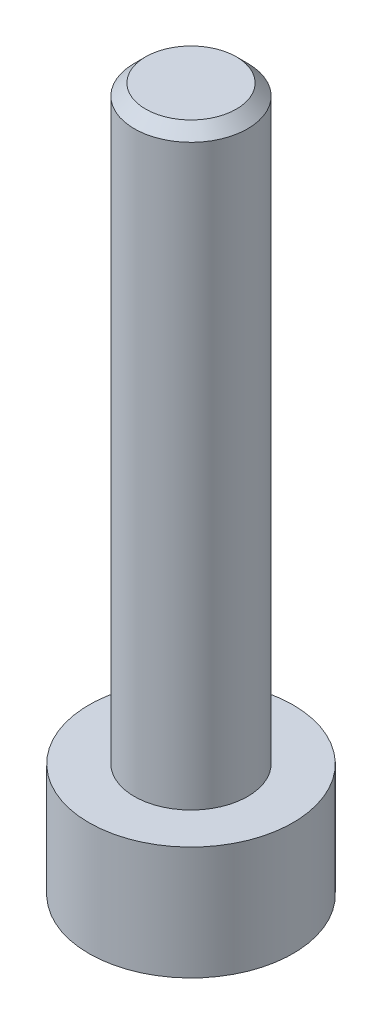
ISO-10303-21;
HEADER;
FILE_DESCRIPTION(('STEP AP214'),'2;1');
FILE_NAME('part.step','',(''),(''),'','','');
FILE_SCHEMA(('AUTOMOTIVE_DESIGN { 1 0 10303 214 1 1 1 1 }'));
ENDSEC;
DATA;
#1=APPLICATION_CONTEXT('core data for automotive mechanical design processes');
#2=APPLICATION_PROTOCOL_DEFINITION('international standard','automotive_design',2000,#1);
#3=PRODUCT_CONTEXT('',#1,'mechanical');
#4=PRODUCT('Part','Part','',(#3));
#5=PRODUCT_RELATED_PRODUCT_CATEGORY('part','',(#4));
#6=PRODUCT_DEFINITION_FORMATION('','',#4);
#7=PRODUCT_DEFINITION_CONTEXT('part definition',#1,'design');
#8=PRODUCT_DEFINITION('design','',#6,#7);
#9=PRODUCT_DEFINITION_SHAPE('','',#8);
#10=(LENGTH_UNIT() NAMED_UNIT(*) SI_UNIT(.MILLI.,.METRE.));
#11=(NAMED_UNIT(*) PLANE_ANGLE_UNIT() SI_UNIT($,.RADIAN.));
#12=(NAMED_UNIT(*) SI_UNIT($,.STERADIAN.) SOLID_ANGLE_UNIT());
#13=UNCERTAINTY_MEASURE_WITH_UNIT(LENGTH_MEASURE(1.E-05),#10,'distance_accuracy_value','');
#14=(GEOMETRIC_REPRESENTATION_CONTEXT(3) GLOBAL_UNCERTAINTY_ASSIGNED_CONTEXT((#13)) GLOBAL_UNIT_ASSIGNED_CONTEXT((#10,
#11,#12)) REPRESENTATION_CONTEXT('',''));
#15=CARTESIAN_POINT('',(0.,0.,0.));
#16=DIRECTION('',(0.,0.,1.));
#17=DIRECTION('',(1.,0.,0.));
#18=AXIS2_PLACEMENT_3D('',#15,#16,#17);
#19=CARTESIAN_POINT('',(0.,2.5,0.));
#20=DIRECTION('',(0.,-1.,0.));
#21=DIRECTION('',(0.,0.,-1.));
#22=AXIS2_PLACEMENT_3D('',#19,#20,#21);
#23=CYLINDRICAL_SURFACE('',#22,2.25);
#24=CARTESIAN_POINT('',(0.,2.5,0.));
#25=DIRECTION('',(0.,1.,0.));
#26=DIRECTION('',(0.,0.,1.));
#27=AXIS2_PLACEMENT_3D('',#24,#25,#26);
#28=CIRCLE('',#27,2.25);
#29=CARTESIAN_POINT('',(0.,2.5,2.25));
#30=VERTEX_POINT('',#29);
#31=EDGE_CURVE('E161',#30,#30,#28,.T.);
#32=ORIENTED_EDGE('',*,*,#31,.F.);
#33=EDGE_LOOP('',(#32));
#34=FACE_BOUND('',#33,.T.);
#35=CARTESIAN_POINT('',(0.,0.,0.));
#36=DIRECTION('',(0.,1.,0.));
#37=DIRECTION('',(0.,0.,1.));
#38=AXIS2_PLACEMENT_3D('',#35,#36,#37);
#39=CIRCLE('',#38,2.25);
#40=CARTESIAN_POINT('',(0.,0.,2.25));
#41=VERTEX_POINT('',#40);
#42=EDGE_CURVE('E152',#41,#41,#39,.T.);
#43=ORIENTED_EDGE('',*,*,#42,.T.);
#44=EDGE_LOOP('',(#43));
#45=FACE_BOUND('',#44,.T.);
#46=ADVANCED_FACE('F49',(#34,#45),#23,.T.);
#47=CARTESIAN_POINT('',(0.,2.5,0.));
#48=DIRECTION('',(0.,1.,0.));
#49=DIRECTION('',(0.,0.,1.));
#50=AXIS2_PLACEMENT_3D('',#47,#48,#49);
#51=PLANE('',#50);
#52=CARTESIAN_POINT('',(0.,2.5,0.));
#53=DIRECTION('',(0.,1.,0.));
#54=DIRECTION('',(0.,0.,1.));
#55=AXIS2_PLACEMENT_3D('',#52,#53,#54);
#56=CIRCLE('',#55,1.25);
#57=CARTESIAN_POINT('',(0.,2.5,-1.25));
#58=VERTEX_POINT('',#57);
#59=EDGE_CURVE('E158',#58,#58,#56,.T.);
#60=ORIENTED_EDGE('',*,*,#59,.F.);
#61=EDGE_LOOP('',(#60));
#62=FACE_BOUND('',#61,.T.);
#63=ORIENTED_EDGE('',*,*,#31,.T.);
#64=EDGE_LOOP('',(#63));
#65=FACE_BOUND('',#64,.T.);
#66=ADVANCED_FACE('F181',(#62,#65),#51,.T.);
#67=CARTESIAN_POINT('',(0.,0.,0.));
#68=DIRECTION('',(0.,1.,0.));
#69=DIRECTION('',(0.,0.,1.));
#70=AXIS2_PLACEMENT_3D('',#67,#68,#69);
#71=PLANE('',#70);
#72=DIRECTION('',(0.866025403784438,0.,0.5));
#73=VECTOR('',#72,1.);
#74=CARTESIAN_POINT('',(0.,0.,-1.15470053837925));
#75=LINE('',#74,#73);
#76=CARTESIAN_POINT('',(0.,0.,-1.15470053837925));
#77=VERTEX_POINT('',#76);
#78=CARTESIAN_POINT('',(1.,0.,-0.577350269189626));
#79=VERTEX_POINT('',#78);
#80=EDGE_CURVE('E139',#77,#79,#75,.T.);
#81=ORIENTED_EDGE('',*,*,#80,.F.);
#82=DIRECTION('',(0.866025403784438,0.,-0.5));
#83=VECTOR('',#82,1.);
#84=CARTESIAN_POINT('',(-1.,0.,-0.577350269189625));
#85=LINE('',#84,#83);
#86=CARTESIAN_POINT('',(-1.,0.,-0.577350269189625));
#87=VERTEX_POINT('',#86);
#88=EDGE_CURVE('E65',#87,#77,#85,.T.);
#89=ORIENTED_EDGE('',*,*,#88,.F.);
#90=DIRECTION('',(0.,0.,-1.));
#91=VECTOR('',#90,1.);
#92=CARTESIAN_POINT('',(-1.,0.,0.577350269189626));
#93=LINE('',#92,#91);
#94=CARTESIAN_POINT('',(-1.,0.,0.577350269189626));
#95=VERTEX_POINT('',#94);
#96=EDGE_CURVE('E148',#95,#87,#93,.T.);
#97=ORIENTED_EDGE('',*,*,#96,.F.);
#98=DIRECTION('',(-0.866025403784439,0.,-0.5));
#99=VECTOR('',#98,1.);
#100=CARTESIAN_POINT('',(0.,0.,1.15470053837925));
#101=LINE('',#100,#99);
#102=CARTESIAN_POINT('',(0.,0.,1.15470053837925));
#103=VERTEX_POINT('',#102);
#104=EDGE_CURVE('E146',#103,#95,#101,.T.);
#105=ORIENTED_EDGE('',*,*,#104,.F.);
#106=DIRECTION('',(-0.866025403784439,0.,0.5));
#107=VECTOR('',#106,1.);
#108=CARTESIAN_POINT('',(1.,0.,0.577350269189627));
#109=LINE('',#108,#107);
#110=CARTESIAN_POINT('',(1.,0.,0.577350269189627));
#111=VERTEX_POINT('',#110);
#112=EDGE_CURVE('E113',#111,#103,#109,.T.);
#113=ORIENTED_EDGE('',*,*,#112,.F.);
#114=DIRECTION('',(0.,0.,1.));
#115=VECTOR('',#114,1.);
#116=CARTESIAN_POINT('',(1.,0.,-0.577350269189626));
#117=LINE('',#116,#115);
#118=EDGE_CURVE('E142',#79,#111,#117,.T.);
#119=ORIENTED_EDGE('',*,*,#118,.F.);
#120=EDGE_LOOP('',(#81,#89,#97,#105,#113,#119));
#121=FACE_BOUND('',#120,.T.);
#122=ORIENTED_EDGE('',*,*,#42,.F.);
#123=EDGE_LOOP('',(#122));
#124=FACE_BOUND('',#123,.T.);
#125=ADVANCED_FACE('F186',(#121,#124),#71,.F.);
#126=CARTESIAN_POINT('',(0.,15.5,0.));
#127=DIRECTION('',(0.,-1.,0.));
#128=DIRECTION('',(0.,0.,-1.));
#129=AXIS2_PLACEMENT_3D('',#126,#127,#128);
#130=CYLINDRICAL_SURFACE('',#129,1.25);
#131=CARTESIAN_POINT('',(0.,15.25,0.));
#132=DIRECTION('',(0.,1.,0.));
#133=DIRECTION('',(0.,0.,1.));
#134=AXIS2_PLACEMENT_3D('',#131,#132,#133);
#135=CIRCLE('',#134,1.25);
#136=CARTESIAN_POINT('',(0.,15.25,-1.25));
#137=VERTEX_POINT('',#136);
#138=EDGE_CURVE('E11',#137,#137,#135,.F.);
#139=CARTESIAN_POINT('',(0.,15.25,-1.25));
#140=CARTESIAN_POINT('',(0.,15.1171875,-1.25));
#141=CARTESIAN_POINT('',(0.,14.984375,-1.25));
#142=CARTESIAN_POINT('',(0.,14.71875,-1.25));
#143=CARTESIAN_POINT('',(0.,14.5859375,-1.25));
#144=CARTESIAN_POINT('',(0.,14.3203125,-1.25));
#145=CARTESIAN_POINT('',(0.,14.1875,-1.25));
#146=CARTESIAN_POINT('',(0.,13.921875,-1.25));
#147=CARTESIAN_POINT('',(0.,13.7890625,-1.25));
#148=CARTESIAN_POINT('',(0.,13.5234375,-1.25));
#149=CARTESIAN_POINT('',(0.,13.390625,-1.25));
#150=CARTESIAN_POINT('',(0.,13.125,-1.25));
#151=CARTESIAN_POINT('',(0.,12.9921875,-1.25));
#152=CARTESIAN_POINT('',(0.,12.7265625,-1.25));
#153=CARTESIAN_POINT('',(0.,12.59375,-1.25));
#154=CARTESIAN_POINT('',(0.,12.328125,-1.25));
#155=CARTESIAN_POINT('',(0.,12.1953125,-1.25));
#156=CARTESIAN_POINT('',(0.,11.9296875,-1.25));
#157=CARTESIAN_POINT('',(0.,11.796875,-1.25));
#158=CARTESIAN_POINT('',(0.,11.53125,-1.25));
#159=CARTESIAN_POINT('',(0.,11.3984375,-1.25));
#160=CARTESIAN_POINT('',(0.,11.1328125,-1.25));
#161=CARTESIAN_POINT('',(0.,11.,-1.25));
#162=CARTESIAN_POINT('',(0.,10.734375,-1.25));
#163=CARTESIAN_POINT('',(0.,10.6015625,-1.25));
#164=CARTESIAN_POINT('',(0.,10.3359375,-1.25));
#165=CARTESIAN_POINT('',(0.,10.203125,-1.25));
#166=CARTESIAN_POINT('',(0.,9.93750000000001,-1.25));
#167=CARTESIAN_POINT('',(0.,9.80468750000001,-1.25));
#168=CARTESIAN_POINT('',(0.,9.53906250000001,-1.25));
#169=CARTESIAN_POINT('',(0.,9.40625000000001,-1.25));
#170=CARTESIAN_POINT('',(0.,9.14062500000001,-1.25));
#171=CARTESIAN_POINT('',(0.,9.00781250000001,-1.25));
#172=CARTESIAN_POINT('',(0.,8.74218750000001,-1.25));
#173=CARTESIAN_POINT('',(0.,8.609375,-1.25));
#174=CARTESIAN_POINT('',(0.,8.34375000000001,-1.25));
#175=CARTESIAN_POINT('',(0.,8.21093750000001,-1.25));
#176=CARTESIAN_POINT('',(0.,7.9453125,-1.25));
#177=CARTESIAN_POINT('',(0.,7.81250000000001,-1.25));
#178=CARTESIAN_POINT('',(0.,7.546875,-1.25));
#179=CARTESIAN_POINT('',(0.,7.4140625,-1.25));
#180=CARTESIAN_POINT('',(0.,7.1484375,-1.25));
#181=CARTESIAN_POINT('',(0.,7.015625,-1.25));
#182=CARTESIAN_POINT('',(0.,6.75,-1.25));
#183=CARTESIAN_POINT('',(0.,6.6171875,-1.25));
#184=CARTESIAN_POINT('',(0.,6.3515625,-1.25));
#185=CARTESIAN_POINT('',(0.,6.21875,-1.25));
#186=CARTESIAN_POINT('',(0.,5.953125,-1.25));
#187=CARTESIAN_POINT('',(0.,5.8203125,-1.25));
#188=CARTESIAN_POINT('',(0.,5.5546875,-1.25));
#189=CARTESIAN_POINT('',(0.,5.421875,-1.25));
#190=CARTESIAN_POINT('',(0.,5.15625,-1.25));
#191=CARTESIAN_POINT('',(0.,5.0234375,-1.25));
#192=CARTESIAN_POINT('',(0.,4.7578125,-1.25));
#193=CARTESIAN_POINT('',(0.,4.625,-1.25));
#194=CARTESIAN_POINT('',(0.,4.359375,-1.25));
#195=CARTESIAN_POINT('',(0.,4.2265625,-1.25));
#196=CARTESIAN_POINT('',(0.,3.9609375,-1.25));
#197=CARTESIAN_POINT('',(0.,3.828125,-1.25));
#198=CARTESIAN_POINT('',(0.,3.5625,-1.25));
#199=CARTESIAN_POINT('',(0.,3.4296875,-1.25));
#200=CARTESIAN_POINT('',(0.,3.1640625,-1.25));
#201=CARTESIAN_POINT('',(0.,3.03125,-1.25));
#202=CARTESIAN_POINT('',(0.,2.765625,-1.25));
#203=CARTESIAN_POINT('',(0.,2.6328125,-1.25));
#204=CARTESIAN_POINT('',(0.,2.5,-1.25));
#205=B_SPLINE_CURVE_WITH_KNOTS('',3,(#139,#140,#141,#142,#143,#144,#145,#146,#147,#148,#149,
#150,#151,#152,#153,#154,#155,#156,#157,#158,#159,#160,#161,#162,#163,#164,#165,#166,#167,#168,
#169,#170,#171,#172,#173,#174,#175,#176,#177,#178,#179,#180,#181,#182,#183,#184,#185,#186,#187,
#188,#189,#190,#191,#192,#193,#194,#195,#196,#197,#198,#199,#200,#201,#202,#203,#204),
.UNSPECIFIED.,.F.,.F.,(4,2,2,2,2,2,2,2,2,2,2,2,2,2,2,2,2,2,2,2,2,2,2,2,2,2,2,2,2,2,2,2,4),(0.,
0.3984375,0.796874999999999,1.1953125,1.59375,1.9921875,2.390625,2.7890625,3.1875,3.5859375,
3.984375,4.3828125,4.78125,5.1796875,5.578125,5.9765625,6.375,6.7734375,7.171875,7.5703125,
7.96875,8.36718750000001,8.765625,9.16406250000001,9.56250000000001,9.96093750000001,10.359375,
10.7578125,11.15625,11.5546875,11.953125,12.3515625,12.75),.UNSPECIFIED.);
#206=EDGE_CURVE('BSEAM193',#137,#58,#205,.T.);
#207=ORIENTED_EDGE('',*,*,#138,.T.);
#208=ORIENTED_EDGE('',*,*,#59,.T.);
#209=ORIENTED_EDGE('',*,*,#206,.T.);
#210=ORIENTED_EDGE('',*,*,#206,.F.);
#211=EDGE_LOOP('',(#207,#209,#208,#210));
#212=FACE_BOUND('',#211,.T.);
#213=ADVANCED_FACE('F193',(#212),#130,.T.);
#214=CARTESIAN_POINT('',(0.,15.5,0.));
#215=DIRECTION('',(0.,1.,0.));
#216=DIRECTION('',(0.,0.,1.));
#217=AXIS2_PLACEMENT_3D('',#214,#215,#216);
#218=PLANE('',#217);
#219=CARTESIAN_POINT('',(0.,15.5,0.));
#220=DIRECTION('',(0.,1.,0.));
#221=DIRECTION('',(0.,0.,1.));
#222=AXIS2_PLACEMENT_3D('',#219,#220,#221);
#223=CIRCLE('',#222,1.00000000000001);
#224=CARTESIAN_POINT('',(0.,15.5,1.00000000000001));
#225=VERTEX_POINT('',#224);
#226=EDGE_CURVE('E58',#225,#225,#223,.T.);
#227=ORIENTED_EDGE('',*,*,#226,.T.);
#228=EDGE_LOOP('',(#227));
#229=FACE_BOUND('',#228,.T.);
#230=ADVANCED_FACE('F168',(#229),#218,.T.);
#231=CARTESIAN_POINT('',(-1.,1.1,-0.577350269189625));
#232=DIRECTION('',(-0.5,0.,-0.866025403784439));
#233=DIRECTION('',(-0.866025403784439,0.,0.5));
#234=AXIS2_PLACEMENT_3D('',#231,#232,#233);
#235=PLANE('',#234);
#236=ORIENTED_EDGE('',*,*,#88,.T.);
#237=DIRECTION('',(0.,-1.,0.));
#238=VECTOR('',#237,1.);
#239=CARTESIAN_POINT('',(0.,1.1,-1.15470053837925));
#240=LINE('',#239,#238);
#241=CARTESIAN_POINT('',(0.,1.1,-1.15470053837925));
#242=VERTEX_POINT('',#241);
#243=EDGE_CURVE('E95',#242,#77,#240,.T.);
#244=ORIENTED_EDGE('',*,*,#243,.F.);
#245=DIRECTION('',(0.866025403784438,0.,-0.5));
#246=VECTOR('',#245,1.);
#247=CARTESIAN_POINT('',(-1.,1.1,-0.577350269189625));
#248=LINE('',#247,#246);
#249=CARTESIAN_POINT('',(-1.,1.1,-0.577350269189625));
#250=VERTEX_POINT('',#249);
#251=EDGE_CURVE('E150',#250,#242,#248,.T.);
#252=ORIENTED_EDGE('',*,*,#251,.F.);
#253=DIRECTION('',(0.,-1.,0.));
#254=VECTOR('',#253,1.);
#255=CARTESIAN_POINT('',(-1.,1.1,-0.577350269189625));
#256=LINE('',#255,#254);
#257=EDGE_CURVE('E73',#250,#87,#256,.T.);
#258=ORIENTED_EDGE('',*,*,#257,.T.);
#259=EDGE_LOOP('',(#236,#244,#252,#258));
#260=FACE_BOUND('',#259,.T.);
#261=ADVANCED_FACE('F201',(#260),#235,.F.);
#262=CARTESIAN_POINT('',(-1.,1.1,0.577350269189626));
#263=DIRECTION('',(-1.,0.,0.));
#264=DIRECTION('',(0.,0.,1.));
#265=AXIS2_PLACEMENT_3D('',#262,#263,#264);
#266=PLANE('',#265);
#267=ORIENTED_EDGE('',*,*,#96,.T.);
#268=ORIENTED_EDGE('',*,*,#257,.F.);
#269=DIRECTION('',(0.,0.,-1.));
#270=VECTOR('',#269,1.);
#271=CARTESIAN_POINT('',(-1.,1.1,0.577350269189626));
#272=LINE('',#271,#270);
#273=CARTESIAN_POINT('',(-1.,1.1,0.577350269189626));
#274=VERTEX_POINT('',#273);
#275=EDGE_CURVE('E125',#274,#250,#272,.T.);
#276=ORIENTED_EDGE('',*,*,#275,.F.);
#277=DIRECTION('',(0.,-1.,0.));
#278=VECTOR('',#277,1.);
#279=CARTESIAN_POINT('',(-1.,1.1,0.577350269189626));
#280=LINE('',#279,#278);
#281=EDGE_CURVE('E117',#274,#95,#280,.T.);
#282=ORIENTED_EDGE('',*,*,#281,.T.);
#283=EDGE_LOOP('',(#267,#268,#276,#282));
#284=FACE_BOUND('',#283,.T.);
#285=ADVANCED_FACE('F204',(#284),#266,.F.);
#286=CARTESIAN_POINT('',(0.,1.1,1.15470053837925));
#287=DIRECTION('',(-0.5,0.,0.866025403784438));
#288=DIRECTION('',(0.866025403784439,0.,0.5));
#289=AXIS2_PLACEMENT_3D('',#286,#287,#288);
#290=PLANE('',#289);
#291=ORIENTED_EDGE('',*,*,#104,.T.);
#292=ORIENTED_EDGE('',*,*,#281,.F.);
#293=DIRECTION('',(-0.866025403784439,0.,-0.5));
#294=VECTOR('',#293,1.);
#295=CARTESIAN_POINT('',(0.,1.1,1.15470053837925));
#296=LINE('',#295,#294);
#297=CARTESIAN_POINT('',(0.,1.1,1.15470053837925));
#298=VERTEX_POINT('',#297);
#299=EDGE_CURVE('E121',#298,#274,#296,.T.);
#300=ORIENTED_EDGE('',*,*,#299,.F.);
#301=DIRECTION('',(0.,-1.,0.));
#302=VECTOR('',#301,1.);
#303=CARTESIAN_POINT('',(0.,1.1,1.15470053837925));
#304=LINE('',#303,#302);
#305=EDGE_CURVE('E106',#298,#103,#304,.T.);
#306=ORIENTED_EDGE('',*,*,#305,.T.);
#307=EDGE_LOOP('',(#291,#292,#300,#306));
#308=FACE_BOUND('',#307,.T.);
#309=ADVANCED_FACE('F122',(#308),#290,.F.);
#310=CARTESIAN_POINT('',(1.,1.1,0.577350269189627));
#311=DIRECTION('',(0.5,0.,0.866025403784439));
#312=DIRECTION('',(0.866025403784439,0.,-0.5));
#313=AXIS2_PLACEMENT_3D('',#310,#311,#312);
#314=PLANE('',#313);
#315=ORIENTED_EDGE('',*,*,#112,.T.);
#316=ORIENTED_EDGE('',*,*,#305,.F.);
#317=DIRECTION('',(-0.866025403784439,0.,0.5));
#318=VECTOR('',#317,1.);
#319=CARTESIAN_POINT('',(1.,1.1,0.577350269189627));
#320=LINE('',#319,#318);
#321=CARTESIAN_POINT('',(1.,1.1,0.577350269189627));
#322=VERTEX_POINT('',#321);
#323=EDGE_CURVE('E110',#322,#298,#320,.T.);
#324=ORIENTED_EDGE('',*,*,#323,.F.);
#325=DIRECTION('',(0.,-1.,0.));
#326=VECTOR('',#325,1.);
#327=CARTESIAN_POINT('',(1.,1.1,0.577350269189627));
#328=LINE('',#327,#326);
#329=EDGE_CURVE('E118',#322,#111,#328,.T.);
#330=ORIENTED_EDGE('',*,*,#329,.T.);
#331=EDGE_LOOP('',(#315,#316,#324,#330));
#332=FACE_BOUND('',#331,.T.);
#333=ADVANCED_FACE('F108',(#332),#314,.F.);
#334=CARTESIAN_POINT('',(1.,1.1,-0.577350269189626));
#335=DIRECTION('',(1.,0.,0.));
#336=DIRECTION('',(0.,0.,-1.));
#337=AXIS2_PLACEMENT_3D('',#334,#335,#336);
#338=PLANE('',#337);
#339=ORIENTED_EDGE('',*,*,#118,.T.);
#340=ORIENTED_EDGE('',*,*,#329,.F.);
#341=DIRECTION('',(0.,0.,1.));
#342=VECTOR('',#341,1.);
#343=CARTESIAN_POINT('',(1.,1.1,-0.577350269189626));
#344=LINE('',#343,#342);
#345=CARTESIAN_POINT('',(1.,1.1,-0.577350269189626));
#346=VERTEX_POINT('',#345);
#347=EDGE_CURVE('E131',#346,#322,#344,.T.);
#348=ORIENTED_EDGE('',*,*,#347,.F.);
#349=DIRECTION('',(0.,-1.,0.));
#350=VECTOR('',#349,1.);
#351=CARTESIAN_POINT('',(1.,1.1,-0.577350269189626));
#352=LINE('',#351,#350);
#353=EDGE_CURVE('E155',#346,#79,#352,.T.);
#354=ORIENTED_EDGE('',*,*,#353,.T.);
#355=EDGE_LOOP('',(#339,#340,#348,#354));
#356=FACE_BOUND('',#355,.T.);
#357=ADVANCED_FACE('F207',(#356),#338,.F.);
#358=CARTESIAN_POINT('',(0.,1.1,-1.15470053837925));
#359=DIRECTION('',(0.5,0.,-0.866025403784438));
#360=DIRECTION('',(-0.866025403784439,0.,-0.5));
#361=AXIS2_PLACEMENT_3D('',#358,#359,#360);
#362=PLANE('',#361);
#363=ORIENTED_EDGE('',*,*,#80,.T.);
#364=ORIENTED_EDGE('',*,*,#353,.F.);
#365=DIRECTION('',(0.866025403784438,0.,0.5));
#366=VECTOR('',#365,1.);
#367=CARTESIAN_POINT('',(0.,1.1,-1.15470053837925));
#368=LINE('',#367,#366);
#369=EDGE_CURVE('E133',#242,#346,#368,.T.);
#370=ORIENTED_EDGE('',*,*,#369,.F.);
#371=ORIENTED_EDGE('',*,*,#243,.T.);
#372=EDGE_LOOP('',(#363,#364,#370,#371));
#373=FACE_BOUND('',#372,.T.);
#374=ADVANCED_FACE('F177',(#373),#362,.F.);
#375=CARTESIAN_POINT('',(0.,1.1,0.));
#376=DIRECTION('',(0.,-1.,0.));
#377=DIRECTION('',(0.,0.,-1.));
#378=AXIS2_PLACEMENT_3D('',#375,#376,#377);
#379=PLANE('',#378);
#380=ORIENTED_EDGE('',*,*,#251,.T.);
#381=ORIENTED_EDGE('',*,*,#369,.T.);
#382=ORIENTED_EDGE('',*,*,#347,.T.);
#383=ORIENTED_EDGE('',*,*,#323,.T.);
#384=ORIENTED_EDGE('',*,*,#299,.T.);
#385=ORIENTED_EDGE('',*,*,#275,.T.);
#386=EDGE_LOOP('',(#380,#381,#382,#383,#384,#385));
#387=FACE_BOUND('',#386,.T.);
#388=ADVANCED_FACE('F128',(#387),#379,.T.);
#389=CARTESIAN_POINT('',(0.,15.5,0.));
#390=DIRECTION('',(0.,-1.,0.));
#391=DIRECTION('',(0.,0.,-1.));
#392=AXIS2_PLACEMENT_3D('',#389,#390,#391);
#393=CONICAL_SURFACE('',#392,1.00000000000001,0.78539816339745);
#394=ORIENTED_EDGE('',*,*,#138,.F.);
#395=EDGE_LOOP('',(#394));
#396=FACE_BOUND('',#395,.T.);
#397=ORIENTED_EDGE('',*,*,#226,.F.);
#398=EDGE_LOOP('',(#397));
#399=FACE_BOUND('',#398,.T.);
#400=ADVANCED_FACE('F52',(#396,#399),#393,.T.);
#401=CLOSED_SHELL('',(#46,#66,#125,#213,#230,#261,#285,#309,#333,#357,#374,#388,#400));
#402=MANIFOLD_SOLID_BREP('B2',#401);
#403=ADVANCED_BREP_SHAPE_REPRESENTATION('',(#18,#402),#14);
#404=SHAPE_DEFINITION_REPRESENTATION(#9,#403);
ENDSEC;
END-ISO-10303-21;
